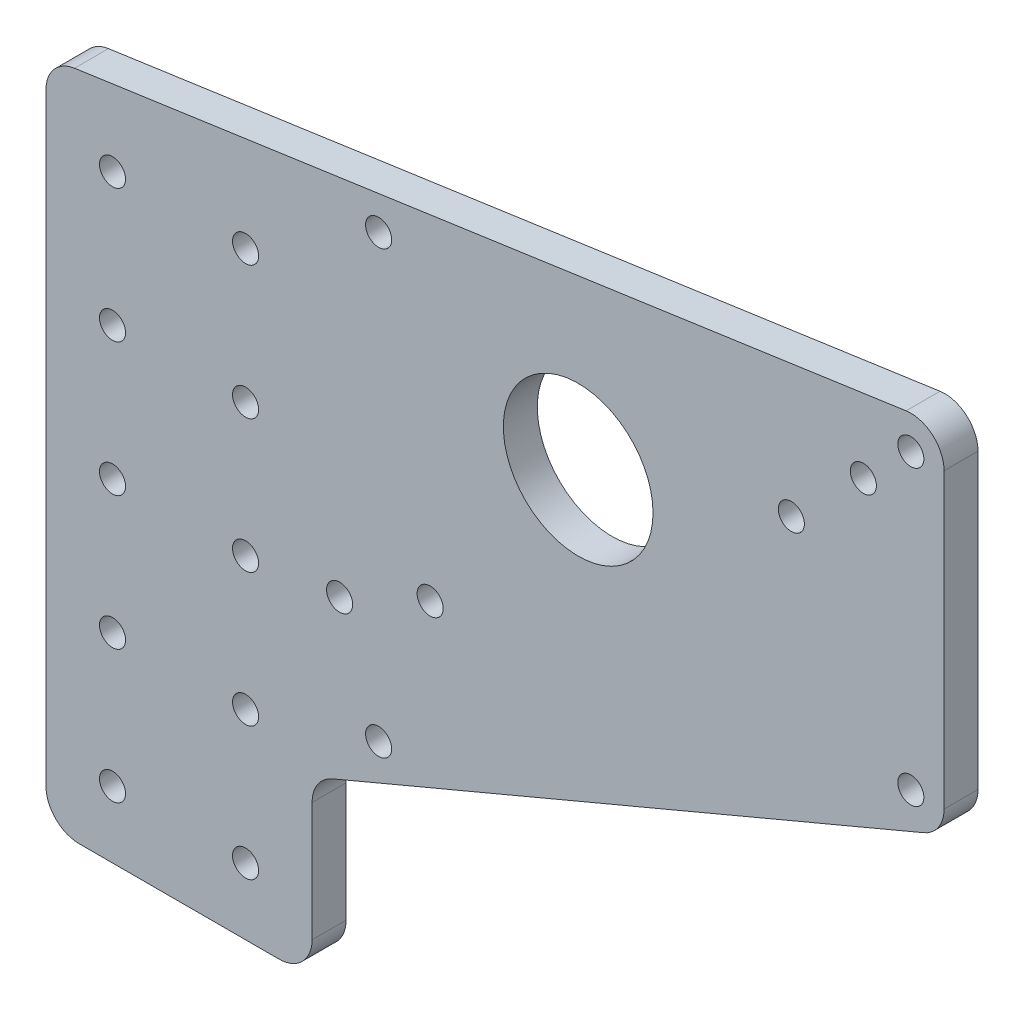
ISO-10303-21;
HEADER;
FILE_DESCRIPTION(('STEP AP214'),'2;1');
FILE_NAME('part.step','',(''),(''),'','','');
FILE_SCHEMA(('AUTOMOTIVE_DESIGN { 1 0 10303 214 1 1 1 1 }'));
ENDSEC;
DATA;
#1=APPLICATION_CONTEXT('core data for automotive mechanical design processes');
#2=APPLICATION_PROTOCOL_DEFINITION('international standard','automotive_design',2000,#1);
#3=PRODUCT_CONTEXT('',#1,'mechanical');
#4=PRODUCT('Part','Part','',(#3));
#5=PRODUCT_RELATED_PRODUCT_CATEGORY('part','',(#4));
#6=PRODUCT_DEFINITION_FORMATION('','',#4);
#7=PRODUCT_DEFINITION_CONTEXT('part definition',#1,'design');
#8=PRODUCT_DEFINITION('design','',#6,#7);
#9=PRODUCT_DEFINITION_SHAPE('','',#8);
#10=(LENGTH_UNIT() NAMED_UNIT(*) SI_UNIT(.MILLI.,.METRE.));
#11=(NAMED_UNIT(*) PLANE_ANGLE_UNIT() SI_UNIT($,.RADIAN.));
#12=(NAMED_UNIT(*) SI_UNIT($,.STERADIAN.) SOLID_ANGLE_UNIT());
#13=UNCERTAINTY_MEASURE_WITH_UNIT(LENGTH_MEASURE(1.E-05),#10,'distance_accuracy_value','');
#14=(GEOMETRIC_REPRESENTATION_CONTEXT(3) GLOBAL_UNCERTAINTY_ASSIGNED_CONTEXT((#13)) GLOBAL_UNIT_ASSIGNED_CONTEXT((#10,
#11,#12)) REPRESENTATION_CONTEXT('',''));
#15=CARTESIAN_POINT('',(0.,0.,0.));
#16=DIRECTION('',(0.,0.,1.));
#17=DIRECTION('',(1.,0.,0.));
#18=AXIS2_PLACEMENT_3D('',#15,#16,#17);
#19=CARTESIAN_POINT('',(482.6,0.,6.477));
#20=DIRECTION('',(1.,0.,0.));
#21=DIRECTION('',(0.,0.,-1.));
#22=AXIS2_PLACEMENT_3D('',#19,#20,#21);
#23=PLANE('',#22);
#24=DIRECTION('',(0.,-1.,0.));
#25=VECTOR('',#24,1.);
#26=CARTESIAN_POINT('',(482.6,0.,6.477));
#27=LINE('',#26,#25);
#28=CARTESIAN_POINT('',(482.6,621.620473744719,6.477));
#29=VERTEX_POINT('',#28);
#30=CARTESIAN_POINT('',(482.6,506.476,6.477));
#31=VERTEX_POINT('',#30);
#32=EDGE_CURVE('E148',#29,#31,#27,.T.);
#33=ORIENTED_EDGE('',*,*,#32,.F.);
#34=DIRECTION('',(0.,0.,-1.));
#35=VECTOR('',#34,1.);
#36=CARTESIAN_POINT('',(482.6,621.620473744719,0.));
#37=LINE('',#36,#35);
#38=CARTESIAN_POINT('',(482.6,621.620473744719,0.));
#39=VERTEX_POINT('',#38);
#40=EDGE_CURVE('E133',#29,#39,#37,.T.);
#41=ORIENTED_EDGE('',*,*,#40,.T.);
#42=DIRECTION('',(0.,-1.,0.));
#43=VECTOR('',#42,1.);
#44=CARTESIAN_POINT('',(482.6,0.,0.));
#45=LINE('',#44,#43);
#46=CARTESIAN_POINT('',(482.6,506.476,0.));
#47=VERTEX_POINT('',#46);
#48=EDGE_CURVE('E145',#39,#47,#45,.T.);
#49=ORIENTED_EDGE('',*,*,#48,.T.);
#50=DIRECTION('',(0.,0.,-1.));
#51=VECTOR('',#50,1.);
#52=CARTESIAN_POINT('',(482.6,506.476,6.477));
#53=LINE('',#52,#51);
#54=EDGE_CURVE('E150',#47,#31,#53,.F.);
#55=ORIENTED_EDGE('',*,*,#54,.T.);
#56=EDGE_LOOP('',(#33,#41,#49,#55));
#57=FACE_BOUND('',#56,.T.);
#58=ADVANCED_FACE('F39',(#57),#23,.F.);
#59=CARTESIAN_POINT('',(0.,500.126,6.477));
#60=DIRECTION('',(0.,1.,0.));
#61=DIRECTION('',(0.,0.,1.));
#62=AXIS2_PLACEMENT_3D('',#59,#60,#61);
#63=PLANE('',#62);
#64=DIRECTION('',(1.,0.,0.));
#65=VECTOR('',#64,1.);
#66=CARTESIAN_POINT('',(0.,500.126,6.477));
#67=LINE('',#66,#65);
#68=CARTESIAN_POINT('',(488.95,500.126,6.477));
#69=VERTEX_POINT('',#68);
#70=CARTESIAN_POINT('',(527.05,500.126,6.477));
#71=VERTEX_POINT('',#70);
#72=EDGE_CURVE('E237',#69,#71,#67,.T.);
#73=ORIENTED_EDGE('',*,*,#72,.F.);
#74=DIRECTION('',(0.,0.,-1.));
#75=VECTOR('',#74,1.);
#76=CARTESIAN_POINT('',(488.95,500.126,6.477));
#77=LINE('',#76,#75);
#78=CARTESIAN_POINT('',(488.95,500.126,0.));
#79=VERTEX_POINT('',#78);
#80=EDGE_CURVE('E212',#69,#79,#77,.T.);
#81=ORIENTED_EDGE('',*,*,#80,.T.);
#82=DIRECTION('',(1.,0.,0.));
#83=VECTOR('',#82,1.);
#84=CARTESIAN_POINT('',(0.,500.126,0.));
#85=LINE('',#84,#83);
#86=CARTESIAN_POINT('',(527.05,500.126,0.));
#87=VERTEX_POINT('',#86);
#88=EDGE_CURVE('E155',#79,#87,#85,.T.);
#89=ORIENTED_EDGE('',*,*,#88,.T.);
#90=DIRECTION('',(0.,0.,-1.));
#91=VECTOR('',#90,1.);
#92=CARTESIAN_POINT('',(527.05,500.126,6.477));
#93=LINE('',#92,#91);
#94=EDGE_CURVE('E210',#87,#71,#93,.F.);
#95=ORIENTED_EDGE('',*,*,#94,.T.);
#96=EDGE_LOOP('',(#73,#81,#89,#95));
#97=FACE_BOUND('',#96,.T.);
#98=ADVANCED_FACE('F261',(#97),#63,.F.);
#99=CARTESIAN_POINT('',(533.4,0.,6.477));
#100=DIRECTION('',(1.,0.,0.));
#101=DIRECTION('',(0.,0.,-1.));
#102=AXIS2_PLACEMENT_3D('',#99,#100,#101);
#103=PLANE('',#102);
#104=DIRECTION('',(0.,-1.,0.));
#105=VECTOR('',#104,1.);
#106=CARTESIAN_POINT('',(533.4,0.,0.));
#107=LINE('',#106,#105);
#108=CARTESIAN_POINT('',(533.4,529.183757704627,0.));
#109=VERTEX_POINT('',#108);
#110=CARTESIAN_POINT('',(533.4,506.476,0.));
#111=VERTEX_POINT('',#110);
#112=EDGE_CURVE('E159',#109,#111,#107,.T.);
#113=ORIENTED_EDGE('',*,*,#112,.F.);
#114=DIRECTION('',(0.,0.,-1.));
#115=VECTOR('',#114,1.);
#116=CARTESIAN_POINT('',(533.4,529.183757704627,6.477));
#117=LINE('',#116,#115);
#118=CARTESIAN_POINT('',(533.4,529.183757704627,6.477));
#119=VERTEX_POINT('',#118);
#120=EDGE_CURVE('E208',#109,#119,#117,.F.);
#121=ORIENTED_EDGE('',*,*,#120,.T.);
#122=DIRECTION('',(0.,-1.,0.));
#123=VECTOR('',#122,1.);
#124=CARTESIAN_POINT('',(533.4,0.,6.477));
#125=LINE('',#124,#123);
#126=CARTESIAN_POINT('',(533.4,506.476,6.477));
#127=VERTEX_POINT('',#126);
#128=EDGE_CURVE('E230',#119,#127,#125,.T.);
#129=ORIENTED_EDGE('',*,*,#128,.T.);
#130=DIRECTION('',(0.,0.,-1.));
#131=VECTOR('',#130,1.);
#132=CARTESIAN_POINT('',(533.4,506.476,0.));
#133=LINE('',#132,#131);
#134=EDGE_CURVE('E205',#127,#111,#133,.T.);
#135=ORIENTED_EDGE('',*,*,#134,.T.);
#136=EDGE_LOOP('',(#113,#121,#129,#135));
#137=FACE_BOUND('',#136,.T.);
#138=ADVANCED_FACE('F220',(#137),#103,.T.);
#139=CARTESIAN_POINT('',(-110.445176470612,262.307294117703,6.477));
#140=DIRECTION('',(0.388057000058133,-0.921635375138065,0.));
#141=DIRECTION('',(0.921635375138065,0.388057000058133,0.));
#142=AXIS2_PLACEMENT_3D('',#139,#140,#141);
#143=PLANE('',#142);
#144=DIRECTION('',(-0.921635375138065,-0.388057000058133,0.));
#145=VECTOR('',#144,1.);
#146=CARTESIAN_POINT('',(-110.445176470612,262.307294117703,0.));
#147=LINE('',#146,#145);
#148=CARTESIAN_POINT('',(650.164161950369,582.56385766338,0.));
#149=VERTEX_POINT('',#148);
#150=CARTESIAN_POINT('',(537.285838049631,535.036142336753,0.));
#151=VERTEX_POINT('',#150);
#152=EDGE_CURVE('E168',#149,#151,#147,.T.);
#153=ORIENTED_EDGE('',*,*,#152,.F.);
#154=DIRECTION('',(0.,0.,-1.));
#155=VECTOR('',#154,1.);
#156=CARTESIAN_POINT('',(650.164161950369,582.56385766338,6.477));
#157=LINE('',#156,#155);
#158=CARTESIAN_POINT('',(650.164161950369,582.56385766338,6.477));
#159=VERTEX_POINT('',#158);
#160=EDGE_CURVE('E203',#149,#159,#157,.F.);
#161=ORIENTED_EDGE('',*,*,#160,.T.);
#162=DIRECTION('',(-0.921635375138065,-0.388057000058133,0.));
#163=VECTOR('',#162,1.);
#164=CARTESIAN_POINT('',(-110.445176470612,262.307294117703,6.477));
#165=LINE('',#164,#163);
#166=CARTESIAN_POINT('',(537.285838049631,535.036142336753,6.477));
#167=VERTEX_POINT('',#166);
#168=EDGE_CURVE('E229',#159,#167,#165,.T.);
#169=ORIENTED_EDGE('',*,*,#168,.T.);
#170=DIRECTION('',(0.,0.,-1.));
#171=VECTOR('',#170,1.);
#172=CARTESIAN_POINT('',(537.285838049631,535.036142336753,0.));
#173=LINE('',#172,#171);
#174=EDGE_CURVE('E200',#167,#151,#173,.T.);
#175=ORIENTED_EDGE('',*,*,#174,.T.);
#176=EDGE_LOOP('',(#153,#161,#169,#175));
#177=FACE_BOUND('',#176,.T.);
#178=ADVANCED_FACE('F232',(#177),#143,.T.);
#179=CARTESIAN_POINT('',(654.05,0.,6.477));
#180=DIRECTION('',(1.,0.,0.));
#181=DIRECTION('',(0.,0.,-1.));
#182=AXIS2_PLACEMENT_3D('',#179,#180,#181);
#183=PLANE('',#182);
#184=DIRECTION('',(0.,-1.,0.));
#185=VECTOR('',#184,1.);
#186=CARTESIAN_POINT('',(654.05,0.,0.));
#187=LINE('',#186,#185);
#188=CARTESIAN_POINT('',(654.05,644.351453918517,0.));
#189=VERTEX_POINT('',#188);
#190=CARTESIAN_POINT('',(654.05,588.416242295507,0.));
#191=VERTEX_POINT('',#190);
#192=EDGE_CURVE('E171',#189,#191,#187,.T.);
#193=ORIENTED_EDGE('',*,*,#192,.F.);
#194=DIRECTION('',(0.,0.,-1.));
#195=VECTOR('',#194,1.);
#196=CARTESIAN_POINT('',(654.05,644.351453918517,6.477));
#197=LINE('',#196,#195);
#198=CARTESIAN_POINT('',(654.05,644.351453918517,6.477));
#199=VERTEX_POINT('',#198);
#200=EDGE_CURVE('E61',#189,#199,#197,.F.);
#201=ORIENTED_EDGE('',*,*,#200,.T.);
#202=DIRECTION('',(0.,-1.,0.));
#203=VECTOR('',#202,1.);
#204=CARTESIAN_POINT('',(654.05,0.,6.477));
#205=LINE('',#204,#203);
#206=CARTESIAN_POINT('',(654.05,588.416242295507,6.477));
#207=VERTEX_POINT('',#206);
#208=EDGE_CURVE('E234',#199,#207,#205,.T.);
#209=ORIENTED_EDGE('',*,*,#208,.T.);
#210=DIRECTION('',(0.,0.,-1.));
#211=VECTOR('',#210,1.);
#212=CARTESIAN_POINT('',(654.05,588.416242295507,6.477));
#213=LINE('',#212,#211);
#214=EDGE_CURVE('E196',#207,#191,#213,.T.);
#215=ORIENTED_EDGE('',*,*,#214,.T.);
#216=EDGE_LOOP('',(#193,#201,#209,#215));
#217=FACE_BOUND('',#216,.T.);
#218=ADVANCED_FACE('F247',(#217),#183,.T.);
#219=CARTESIAN_POINT('',(584.20000000001,609.600000000067,6.477));
#220=DIRECTION('',(0.,0.,-1.));
#221=DIRECTION('',(-1.,0.,0.));
#222=AXIS2_PLACEMENT_3D('',#219,#220,#221);
#223=CYLINDRICAL_SURFACE('',#222,14.2875000000112);
#224=CARTESIAN_POINT('',(584.20000000001,609.600000000067,6.477));
#225=DIRECTION('',(0.,0.,1.));
#226=DIRECTION('',(1.,0.,0.));
#227=AXIS2_PLACEMENT_3D('',#224,#225,#226);
#228=CIRCLE('',#227,14.2875000000112);
#229=CARTESIAN_POINT('',(598.487500000021,609.600000000067,6.477));
#230=VERTEX_POINT('',#229);
#231=EDGE_CURVE('E176',#230,#230,#228,.T.);
#232=ORIENTED_EDGE('',*,*,#231,.T.);
#233=EDGE_LOOP('',(#232));
#234=FACE_BOUND('',#233,.T.);
#235=CARTESIAN_POINT('',(584.20000000001,609.600000000067,0.));
#236=DIRECTION('',(0.,0.,1.));
#237=DIRECTION('',(1.,0.,0.));
#238=AXIS2_PLACEMENT_3D('',#235,#236,#237);
#239=CIRCLE('',#238,14.2875000000112);
#240=CARTESIAN_POINT('',(598.487500000021,609.600000000067,0.));
#241=VERTEX_POINT('',#240);
#242=EDGE_CURVE('E156',#241,#241,#239,.T.);
#243=ORIENTED_EDGE('',*,*,#242,.F.);
#244=EDGE_LOOP('',(#243));
#245=FACE_BOUND('',#244,.T.);
#246=ADVANCED_FACE('F270',(#234,#245),#223,.F.);
#247=CARTESIAN_POINT('',(-78.2966270222328,546.812739474692,6.477));
#248=DIRECTION('',(-0.141741613517293,0.989903689758511,0.));
#249=DIRECTION('',(-0.989903689758511,-0.141741613517293,0.));
#250=AXIS2_PLACEMENT_3D('',#247,#248,#249);
#251=PLANE('',#250);
#252=DIRECTION('',(0.989903689758511,0.141741613517293,0.));
#253=VECTOR('',#252,1.);
#254=CARTESIAN_POINT('',(-78.2966270222328,546.812739474692,0.));
#255=LINE('',#254,#253);
#256=CARTESIAN_POINT('',(488.049940754166,627.906362174685,0.));
#257=VERTEX_POINT('',#256);
#258=CARTESIAN_POINT('',(646.799940754166,650.637342348483,0.));
#259=VERTEX_POINT('',#258);
#260=EDGE_CURVE('E174',#257,#259,#255,.T.);
#261=ORIENTED_EDGE('',*,*,#260,.F.);
#262=DIRECTION('',(0.,0.,-1.));
#263=VECTOR('',#262,1.);
#264=CARTESIAN_POINT('',(488.049940754165,627.906362174685,6.477));
#265=LINE('',#264,#263);
#266=CARTESIAN_POINT('',(488.049940754166,627.906362174685,6.477));
#267=VERTEX_POINT('',#266);
#268=EDGE_CURVE('E134',#257,#267,#265,.F.);
#269=ORIENTED_EDGE('',*,*,#268,.T.);
#270=DIRECTION('',(0.989903689758511,0.141741613517293,0.));
#271=VECTOR('',#270,1.);
#272=CARTESIAN_POINT('',(-78.2966270222328,546.812739474692,6.477));
#273=LINE('',#272,#271);
#274=CARTESIAN_POINT('',(646.799940754166,650.637342348483,6.477));
#275=VERTEX_POINT('',#274);
#276=EDGE_CURVE('E177',#267,#275,#273,.T.);
#277=ORIENTED_EDGE('',*,*,#276,.T.);
#278=DIRECTION('',(0.,0.,-1.));
#279=VECTOR('',#278,1.);
#280=CARTESIAN_POINT('',(646.799940754165,650.637342348483,6.477));
#281=LINE('',#280,#279);
#282=EDGE_CURVE('E139',#275,#259,#281,.T.);
#283=ORIENTED_EDGE('',*,*,#282,.T.);
#284=EDGE_LOOP('',(#261,#269,#277,#283));
#285=FACE_BOUND('',#284,.T.);
#286=ADVANCED_FACE('F243',(#285),#251,.T.);
#287=CARTESIAN_POINT('',(0.,0.,6.477));
#288=DIRECTION('',(0.,0.,1.));
#289=DIRECTION('',(1.,0.,0.));
#290=AXIS2_PLACEMENT_3D('',#287,#288,#289);
#291=PLANE('',#290);
#292=CARTESIAN_POINT('',(538.656227349492,565.751163692027,6.477));
#293=DIRECTION('',(0.,0.,1.));
#294=DIRECTION('',(1.,0.,0.));
#295=AXIS2_PLACEMENT_3D('',#292,#293,#294);
#296=CIRCLE('',#295,2.48919999999994);
#297=CARTESIAN_POINT('',(541.145427349492,565.751163692027,6.477));
#298=VERTEX_POINT('',#297);
#299=EDGE_CURVE('E628',#298,#298,#296,.T.);
#300=ORIENTED_EDGE('',*,*,#299,.F.);
#301=EDGE_LOOP('',(#300));
#302=FACE_BOUND('',#301,.T.);
#303=CARTESIAN_POINT('',(624.886821056252,622.213290305826,6.477));
#304=DIRECTION('',(0.,0.,1.));
#305=DIRECTION('',(1.,0.,0.));
#306=AXIS2_PLACEMENT_3D('',#303,#304,#305);
#307=CIRCLE('',#306,2.48919999999927);
#308=CARTESIAN_POINT('',(627.376021056251,622.213290305826,6.477));
#309=VERTEX_POINT('',#308);
#310=EDGE_CURVE('E644',#309,#309,#307,.T.);
#311=ORIENTED_EDGE('',*,*,#310,.F.);
#312=EDGE_LOOP('',(#311));
#313=FACE_BOUND('',#312,.T.);
#314=CARTESIAN_POINT('',(638.638891417596,635.395970639378,6.477));
#315=DIRECTION('',(0.,0.,1.));
#316=DIRECTION('',(1.,0.,0.));
#317=AXIS2_PLACEMENT_3D('',#314,#315,#316);
#318=CIRCLE('',#317,2.48919999999983);
#319=CARTESIAN_POINT('',(641.128091417596,635.395970639378,6.477));
#320=VERTEX_POINT('',#319);
#321=EDGE_CURVE('E643',#320,#320,#318,.T.);
#322=ORIENTED_EDGE('',*,*,#321,.F.);
#323=EDGE_LOOP('',(#322));
#324=FACE_BOUND('',#323,.T.);
#325=CARTESIAN_POINT('',(555.940811586506,573.760261503491,6.477));
#326=DIRECTION('',(0.,0.,1.));
#327=DIRECTION('',(1.,0.,0.));
#328=AXIS2_PLACEMENT_3D('',#325,#326,#327);
#329=CIRCLE('',#328,2.4891999999998);
#330=CARTESIAN_POINT('',(558.430011586505,573.760261503491,6.477));
#331=VERTEX_POINT('',#330);
#332=EDGE_CURVE('E637',#331,#331,#329,.T.);
#333=ORIENTED_EDGE('',*,*,#332,.F.);
#334=EDGE_LOOP('',(#333));
#335=FACE_BOUND('',#334,.T.);
#336=CARTESIAN_POINT('',(520.700000000001,563.626,6.477));
#337=DIRECTION('',(0.,0.,1.));
#338=DIRECTION('',(1.,0.,0.));
#339=AXIS2_PLACEMENT_3D('',#336,#337,#338);
#340=CIRCLE('',#339,2.48919999999994);
#341=CARTESIAN_POINT('',(523.189200000001,563.626,6.477));
#342=VERTEX_POINT('',#341);
#343=EDGE_CURVE('E671',#342,#342,#340,.T.);
#344=ORIENTED_EDGE('',*,*,#343,.F.);
#345=EDGE_LOOP('',(#344));
#346=FACE_BOUND('',#345,.T.);
#347=CARTESIAN_POINT('',(495.300000000001,563.626,6.477));
#348=DIRECTION('',(0.,0.,1.));
#349=DIRECTION('',(1.,0.,0.));
#350=AXIS2_PLACEMENT_3D('',#347,#348,#349);
#351=CIRCLE('',#350,2.48919999999999);
#352=CARTESIAN_POINT('',(497.789200000001,563.626,6.477));
#353=VERTEX_POINT('',#352);
#354=EDGE_CURVE('E700',#353,#353,#351,.T.);
#355=ORIENTED_EDGE('',*,*,#354,.F.);
#356=EDGE_LOOP('',(#355));
#357=FACE_BOUND('',#356,.T.);
#358=CARTESIAN_POINT('',(520.7,589.026,6.477));
#359=DIRECTION('',(0.,0.,1.));
#360=DIRECTION('',(1.,0.,0.));
#361=AXIS2_PLACEMENT_3D('',#358,#359,#360);
#362=CIRCLE('',#361,2.48919999999994);
#363=CARTESIAN_POINT('',(523.1892,589.026,6.477));
#364=VERTEX_POINT('',#363);
#365=EDGE_CURVE('E694',#364,#364,#362,.T.);
#366=ORIENTED_EDGE('',*,*,#365,.F.);
#367=EDGE_LOOP('',(#366));
#368=FACE_BOUND('',#367,.T.);
#369=CARTESIAN_POINT('',(495.3,589.026,6.477));
#370=DIRECTION('',(0.,0.,1.));
#371=DIRECTION('',(1.,0.,0.));
#372=AXIS2_PLACEMENT_3D('',#369,#370,#371);
#373=CIRCLE('',#372,2.48919999999999);
#374=CARTESIAN_POINT('',(497.7892,589.026,6.477));
#375=VERTEX_POINT('',#374);
#376=EDGE_CURVE('E688',#375,#375,#373,.T.);
#377=ORIENTED_EDGE('',*,*,#376,.F.);
#378=EDGE_LOOP('',(#377));
#379=FACE_BOUND('',#378,.T.);
#380=CARTESIAN_POINT('',(495.3,614.426,6.477));
#381=DIRECTION('',(0.,0.,1.));
#382=DIRECTION('',(1.,0.,0.));
#383=AXIS2_PLACEMENT_3D('',#380,#381,#382);
#384=CIRCLE('',#383,2.48919999999999);
#385=CARTESIAN_POINT('',(497.7892,614.426,6.477));
#386=VERTEX_POINT('',#385);
#387=EDGE_CURVE('E687',#386,#386,#384,.T.);
#388=ORIENTED_EDGE('',*,*,#387,.F.);
#389=EDGE_LOOP('',(#388));
#390=FACE_BOUND('',#389,.T.);
#391=CARTESIAN_POINT('',(520.7,614.426,6.477));
#392=DIRECTION('',(0.,0.,1.));
#393=DIRECTION('',(1.,0.,0.));
#394=AXIS2_PLACEMENT_3D('',#391,#392,#393);
#395=CIRCLE('',#394,2.48920000000004);
#396=CARTESIAN_POINT('',(523.1892,614.426,6.477));
#397=VERTEX_POINT('',#396);
#398=EDGE_CURVE('E723',#397,#397,#395,.T.);
#399=ORIENTED_EDGE('',*,*,#398,.F.);
#400=EDGE_LOOP('',(#399));
#401=FACE_BOUND('',#400,.T.);
#402=CARTESIAN_POINT('',(520.700000000001,538.226,6.477));
#403=DIRECTION('',(0.,0.,1.));
#404=DIRECTION('',(1.,0.,0.));
#405=AXIS2_PLACEMENT_3D('',#402,#403,#404);
#406=CIRCLE('',#405,2.48920000000008);
#407=CARTESIAN_POINT('',(523.189200000001,538.226,6.477));
#408=VERTEX_POINT('',#407);
#409=EDGE_CURVE('E717',#408,#408,#406,.T.);
#410=ORIENTED_EDGE('',*,*,#409,.F.);
#411=EDGE_LOOP('',(#410));
#412=FACE_BOUND('',#411,.T.);
#413=CARTESIAN_POINT('',(495.300000000001,538.226,6.477));
#414=DIRECTION('',(0.,0.,1.));
#415=DIRECTION('',(1.,0.,0.));
#416=AXIS2_PLACEMENT_3D('',#413,#414,#415);
#417=CIRCLE('',#416,2.48920000000002);
#418=CARTESIAN_POINT('',(497.789200000001,538.226,6.477));
#419=VERTEX_POINT('',#418);
#420=EDGE_CURVE('E711',#419,#419,#417,.T.);
#421=ORIENTED_EDGE('',*,*,#420,.F.);
#422=EDGE_LOOP('',(#421));
#423=FACE_BOUND('',#422,.T.);
#424=CARTESIAN_POINT('',(647.7,588.416242295507,6.477));
#425=DIRECTION('',(0.,0.,1.));
#426=DIRECTION('',(1.,0.,0.));
#427=AXIS2_PLACEMENT_3D('',#424,#425,#426);
#428=CIRCLE('',#427,2.48919999999994);
#429=CARTESIAN_POINT('',(650.1892,588.416242295507,6.477));
#430=VERTEX_POINT('',#429);
#431=EDGE_CURVE('E664',#430,#430,#428,.T.);
#432=ORIENTED_EDGE('',*,*,#431,.F.);
#433=EDGE_LOOP('',(#432));
#434=FACE_BOUND('',#433,.T.);
#435=CARTESIAN_POINT('',(546.1,545.637294927086,6.477));
#436=DIRECTION('',(0.,0.,1.));
#437=DIRECTION('',(1.,0.,0.));
#438=AXIS2_PLACEMENT_3D('',#435,#436,#437);
#439=CIRCLE('',#438,2.48919999999994);
#440=CARTESIAN_POINT('',(548.5892,545.637294927086,6.477));
#441=VERTEX_POINT('',#440);
#442=EDGE_CURVE('E658',#441,#441,#439,.T.);
#443=ORIENTED_EDGE('',*,*,#442,.F.);
#444=EDGE_LOOP('',(#443));
#445=FACE_BOUND('',#444,.T.);
#446=CARTESIAN_POINT('',(546.1,629.803626607286,6.477));
#447=DIRECTION('',(0.,0.,1.));
#448=DIRECTION('',(1.,0.,0.));
#449=AXIS2_PLACEMENT_3D('',#446,#447,#448);
#450=CIRCLE('',#449,2.48919999999994);
#451=CARTESIAN_POINT('',(548.5892,629.803626607286,6.477));
#452=VERTEX_POINT('',#451);
#453=EDGE_CURVE('E657',#452,#452,#450,.T.);
#454=ORIENTED_EDGE('',*,*,#453,.F.);
#455=EDGE_LOOP('',(#454));
#456=FACE_BOUND('',#455,.T.);
#457=CARTESIAN_POINT('',(520.7,512.826,6.477));
#458=DIRECTION('',(0.,0.,1.));
#459=DIRECTION('',(1.,0.,0.));
#460=AXIS2_PLACEMENT_3D('',#457,#458,#459);
#461=CIRCLE('',#460,2.48920000000004);
#462=CARTESIAN_POINT('',(523.1892,512.826,6.477));
#463=VERTEX_POINT('',#462);
#464=EDGE_CURVE('E672',#463,#463,#461,.T.);
#465=ORIENTED_EDGE('',*,*,#464,.F.);
#466=EDGE_LOOP('',(#465));
#467=FACE_BOUND('',#466,.T.);
#468=CARTESIAN_POINT('',(647.7,644.351453918517,6.477));
#469=DIRECTION('',(0.,0.,1.));
#470=DIRECTION('',(1.,0.,0.));
#471=AXIS2_PLACEMENT_3D('',#468,#469,#470);
#472=CIRCLE('',#471,2.48919999999994);
#473=CARTESIAN_POINT('',(650.1892,644.351453918517,6.477));
#474=VERTEX_POINT('',#473);
#475=EDGE_CURVE('E634',#474,#474,#472,.T.);
#476=ORIENTED_EDGE('',*,*,#475,.F.);
#477=EDGE_LOOP('',(#476));
#478=FACE_BOUND('',#477,.T.);
#479=CARTESIAN_POINT('',(495.3,512.826,6.477));
#480=DIRECTION('',(0.,0.,1.));
#481=DIRECTION('',(1.,0.,0.));
#482=AXIS2_PLACEMENT_3D('',#479,#480,#481);
#483=CIRCLE('',#482,2.48919999999999);
#484=CARTESIAN_POINT('',(497.7892,512.826,6.477));
#485=VERTEX_POINT('',#484);
#486=EDGE_CURVE('E162',#485,#485,#483,.T.);
#487=ORIENTED_EDGE('',*,*,#486,.F.);
#488=EDGE_LOOP('',(#487));
#489=FACE_BOUND('',#488,.T.);
#490=ORIENTED_EDGE('',*,*,#231,.F.);
#491=EDGE_LOOP('',(#490));
#492=FACE_BOUND('',#491,.T.);
#493=ORIENTED_EDGE('',*,*,#276,.F.);
#494=CARTESIAN_POINT('',(488.95,621.620473744719,6.477));
#495=DIRECTION('',(0.,0.,1.));
#496=DIRECTION('',(1.,0.,0.));
#497=AXIS2_PLACEMENT_3D('',#494,#495,#496);
#498=CIRCLE('',#497,6.35);
#499=EDGE_CURVE('E194',#267,#29,#498,.T.);
#500=ORIENTED_EDGE('',*,*,#499,.T.);
#501=ORIENTED_EDGE('',*,*,#32,.T.);
#502=CARTESIAN_POINT('',(488.95,506.476,6.477));
#503=DIRECTION('',(0.,0.,1.));
#504=DIRECTION('',(1.,0.,0.));
#505=AXIS2_PLACEMENT_3D('',#502,#503,#504);
#506=CIRCLE('',#505,6.35);
#507=EDGE_CURVE('E189',#31,#69,#506,.T.);
#508=ORIENTED_EDGE('',*,*,#507,.T.);
#509=ORIENTED_EDGE('',*,*,#72,.T.);
#510=CARTESIAN_POINT('',(527.05,506.476,6.477));
#511=DIRECTION('',(0.,0.,1.));
#512=DIRECTION('',(1.,0.,0.));
#513=AXIS2_PLACEMENT_3D('',#510,#511,#512);
#514=CIRCLE('',#513,6.35);
#515=EDGE_CURVE('E187',#71,#127,#514,.T.);
#516=ORIENTED_EDGE('',*,*,#515,.T.);
#517=ORIENTED_EDGE('',*,*,#128,.F.);
#518=CARTESIAN_POINT('',(539.75,529.183757704627,6.477));
#519=DIRECTION('',(0.,0.,1.));
#520=DIRECTION('',(1.,0.,0.));
#521=AXIS2_PLACEMENT_3D('',#518,#519,#520);
#522=CIRCLE('',#521,6.35);
#523=EDGE_CURVE('E11',#119,#167,#522,.F.);
#524=ORIENTED_EDGE('',*,*,#523,.T.);
#525=ORIENTED_EDGE('',*,*,#168,.F.);
#526=CARTESIAN_POINT('',(647.7,588.416242295507,6.477));
#527=DIRECTION('',(0.,0.,1.));
#528=DIRECTION('',(1.,0.,0.));
#529=AXIS2_PLACEMENT_3D('',#526,#527,#528);
#530=CIRCLE('',#529,6.35);
#531=EDGE_CURVE('E54',#159,#207,#530,.T.);
#532=ORIENTED_EDGE('',*,*,#531,.T.);
#533=ORIENTED_EDGE('',*,*,#208,.F.);
#534=CARTESIAN_POINT('',(647.7,644.351453918517,6.477));
#535=DIRECTION('',(0.,0.,1.));
#536=DIRECTION('',(1.,0.,0.));
#537=AXIS2_PLACEMENT_3D('',#534,#535,#536);
#538=CIRCLE('',#537,6.35);
#539=EDGE_CURVE('E192',#199,#275,#538,.T.);
#540=ORIENTED_EDGE('',*,*,#539,.T.);
#541=EDGE_LOOP('',(#493,#500,#501,#508,#509,#516,#517,#524,#525,#532,#533,#540));
#542=FACE_BOUND('',#541,.T.);
#543=ADVANCED_FACE('F228',(#302,#313,#324,#335,#346,#357,#368,#379,#390,#401,#412,#423,#434,
#445,#456,#467,#478,#489,#492,#542),#291,.T.);
#544=CARTESIAN_POINT('',(0.,0.,0.));
#545=DIRECTION('',(0.,0.,1.));
#546=DIRECTION('',(1.,0.,0.));
#547=AXIS2_PLACEMENT_3D('',#544,#545,#546);
#548=PLANE('',#547);
#549=CARTESIAN_POINT('',(538.656227349492,565.751163692027,0.));
#550=DIRECTION('',(0.,0.,1.));
#551=DIRECTION('',(1.,0.,0.));
#552=AXIS2_PLACEMENT_3D('',#549,#550,#551);
#553=CIRCLE('',#552,2.48919999999994);
#554=CARTESIAN_POINT('',(541.145427349492,565.751163692027,0.));
#555=VERTEX_POINT('',#554);
#556=EDGE_CURVE('E631',#555,#555,#553,.T.);
#557=ORIENTED_EDGE('',*,*,#556,.T.);
#558=EDGE_LOOP('',(#557));
#559=FACE_BOUND('',#558,.T.);
#560=CARTESIAN_POINT('',(624.886821056252,622.213290305826,0.));
#561=DIRECTION('',(0.,0.,1.));
#562=DIRECTION('',(1.,0.,0.));
#563=AXIS2_PLACEMENT_3D('',#560,#561,#562);
#564=CIRCLE('',#563,2.48919999999927);
#565=CARTESIAN_POINT('',(627.376021056251,622.213290305826,0.));
#566=VERTEX_POINT('',#565);
#567=EDGE_CURVE('E640',#566,#566,#564,.T.);
#568=ORIENTED_EDGE('',*,*,#567,.T.);
#569=EDGE_LOOP('',(#568));
#570=FACE_BOUND('',#569,.T.);
#571=CARTESIAN_POINT('',(638.638891417596,635.395970639378,0.));
#572=DIRECTION('',(0.,0.,1.));
#573=DIRECTION('',(1.,0.,0.));
#574=AXIS2_PLACEMENT_3D('',#571,#572,#573);
#575=CIRCLE('',#574,2.48919999999983);
#576=CARTESIAN_POINT('',(641.128091417596,635.395970639378,0.));
#577=VERTEX_POINT('',#576);
#578=EDGE_CURVE('E649',#577,#577,#575,.T.);
#579=ORIENTED_EDGE('',*,*,#578,.T.);
#580=EDGE_LOOP('',(#579));
#581=FACE_BOUND('',#580,.T.);
#582=CARTESIAN_POINT('',(555.940811586506,573.760261503491,0.));
#583=DIRECTION('',(0.,0.,1.));
#584=DIRECTION('',(1.,0.,0.));
#585=AXIS2_PLACEMENT_3D('',#582,#583,#584);
#586=CIRCLE('',#585,2.4891999999998);
#587=CARTESIAN_POINT('',(558.430011586505,573.760261503491,0.));
#588=VERTEX_POINT('',#587);
#589=EDGE_CURVE('E632',#588,#588,#586,.T.);
#590=ORIENTED_EDGE('',*,*,#589,.T.);
#591=EDGE_LOOP('',(#590));
#592=FACE_BOUND('',#591,.T.);
#593=CARTESIAN_POINT('',(520.700000000001,563.626,0.));
#594=DIRECTION('',(0.,0.,1.));
#595=DIRECTION('',(1.,0.,0.));
#596=AXIS2_PLACEMENT_3D('',#593,#594,#595);
#597=CIRCLE('',#596,2.48919999999994);
#598=CARTESIAN_POINT('',(523.189200000001,563.626,0.));
#599=VERTEX_POINT('',#598);
#600=EDGE_CURVE('E703',#599,#599,#597,.T.);
#601=ORIENTED_EDGE('',*,*,#600,.T.);
#602=EDGE_LOOP('',(#601));
#603=FACE_BOUND('',#602,.T.);
#604=CARTESIAN_POINT('',(495.300000000001,563.626,0.));
#605=DIRECTION('',(0.,0.,1.));
#606=DIRECTION('',(1.,0.,0.));
#607=AXIS2_PLACEMENT_3D('',#604,#605,#606);
#608=CIRCLE('',#607,2.48919999999999);
#609=CARTESIAN_POINT('',(497.789200000001,563.626,0.));
#610=VERTEX_POINT('',#609);
#611=EDGE_CURVE('E697',#610,#610,#608,.T.);
#612=ORIENTED_EDGE('',*,*,#611,.T.);
#613=EDGE_LOOP('',(#612));
#614=FACE_BOUND('',#613,.T.);
#615=CARTESIAN_POINT('',(520.7,589.026,0.));
#616=DIRECTION('',(0.,0.,1.));
#617=DIRECTION('',(1.,0.,0.));
#618=AXIS2_PLACEMENT_3D('',#615,#616,#617);
#619=CIRCLE('',#618,2.48919999999994);
#620=CARTESIAN_POINT('',(523.1892,589.026,0.));
#621=VERTEX_POINT('',#620);
#622=EDGE_CURVE('E691',#621,#621,#619,.T.);
#623=ORIENTED_EDGE('',*,*,#622,.T.);
#624=EDGE_LOOP('',(#623));
#625=FACE_BOUND('',#624,.T.);
#626=CARTESIAN_POINT('',(495.3,589.026,0.));
#627=DIRECTION('',(0.,0.,1.));
#628=DIRECTION('',(1.,0.,0.));
#629=AXIS2_PLACEMENT_3D('',#626,#627,#628);
#630=CIRCLE('',#629,2.48919999999999);
#631=CARTESIAN_POINT('',(497.7892,589.026,0.));
#632=VERTEX_POINT('',#631);
#633=EDGE_CURVE('E684',#632,#632,#630,.T.);
#634=ORIENTED_EDGE('',*,*,#633,.T.);
#635=EDGE_LOOP('',(#634));
#636=FACE_BOUND('',#635,.T.);
#637=CARTESIAN_POINT('',(495.3,614.426,0.));
#638=DIRECTION('',(0.,0.,1.));
#639=DIRECTION('',(1.,0.,0.));
#640=AXIS2_PLACEMENT_3D('',#637,#638,#639);
#641=CIRCLE('',#640,2.48919999999999);
#642=CARTESIAN_POINT('',(497.7892,614.426,0.));
#643=VERTEX_POINT('',#642);
#644=EDGE_CURVE('E726',#643,#643,#641,.T.);
#645=ORIENTED_EDGE('',*,*,#644,.T.);
#646=EDGE_LOOP('',(#645));
#647=FACE_BOUND('',#646,.T.);
#648=CARTESIAN_POINT('',(520.7,614.426,0.));
#649=DIRECTION('',(0.,0.,1.));
#650=DIRECTION('',(1.,0.,0.));
#651=AXIS2_PLACEMENT_3D('',#648,#649,#650);
#652=CIRCLE('',#651,2.48920000000004);
#653=CARTESIAN_POINT('',(523.1892,614.426,0.));
#654=VERTEX_POINT('',#653);
#655=EDGE_CURVE('E720',#654,#654,#652,.T.);
#656=ORIENTED_EDGE('',*,*,#655,.T.);
#657=EDGE_LOOP('',(#656));
#658=FACE_BOUND('',#657,.T.);
#659=CARTESIAN_POINT('',(520.700000000001,538.226,0.));
#660=DIRECTION('',(0.,0.,1.));
#661=DIRECTION('',(1.,0.,0.));
#662=AXIS2_PLACEMENT_3D('',#659,#660,#661);
#663=CIRCLE('',#662,2.48920000000008);
#664=CARTESIAN_POINT('',(523.189200000001,538.226,0.));
#665=VERTEX_POINT('',#664);
#666=EDGE_CURVE('E714',#665,#665,#663,.T.);
#667=ORIENTED_EDGE('',*,*,#666,.T.);
#668=EDGE_LOOP('',(#667));
#669=FACE_BOUND('',#668,.T.);
#670=CARTESIAN_POINT('',(495.300000000001,538.226,0.));
#671=DIRECTION('',(0.,0.,1.));
#672=DIRECTION('',(1.,0.,0.));
#673=AXIS2_PLACEMENT_3D('',#670,#671,#672);
#674=CIRCLE('',#673,2.48920000000002);
#675=CARTESIAN_POINT('',(497.789200000001,538.226,0.));
#676=VERTEX_POINT('',#675);
#677=EDGE_CURVE('E707',#676,#676,#674,.T.);
#678=ORIENTED_EDGE('',*,*,#677,.T.);
#679=EDGE_LOOP('',(#678));
#680=FACE_BOUND('',#679,.T.);
#681=CARTESIAN_POINT('',(647.7,588.416242295507,0.));
#682=DIRECTION('',(0.,0.,1.));
#683=DIRECTION('',(1.,0.,0.));
#684=AXIS2_PLACEMENT_3D('',#681,#682,#683);
#685=CIRCLE('',#684,2.48919999999994);
#686=CARTESIAN_POINT('',(650.1892,588.416242295507,0.));
#687=VERTEX_POINT('',#686);
#688=EDGE_CURVE('E661',#687,#687,#685,.T.);
#689=ORIENTED_EDGE('',*,*,#688,.T.);
#690=EDGE_LOOP('',(#689));
#691=FACE_BOUND('',#690,.T.);
#692=CARTESIAN_POINT('',(546.1,545.637294927086,0.));
#693=DIRECTION('',(0.,0.,1.));
#694=DIRECTION('',(1.,0.,0.));
#695=AXIS2_PLACEMENT_3D('',#692,#693,#694);
#696=CIRCLE('',#695,2.48919999999994);
#697=CARTESIAN_POINT('',(548.5892,545.637294927086,0.));
#698=VERTEX_POINT('',#697);
#699=EDGE_CURVE('E654',#698,#698,#696,.T.);
#700=ORIENTED_EDGE('',*,*,#699,.T.);
#701=EDGE_LOOP('',(#700));
#702=FACE_BOUND('',#701,.T.);
#703=CARTESIAN_POINT('',(546.1,629.803626607286,0.));
#704=DIRECTION('',(0.,0.,1.));
#705=DIRECTION('',(1.,0.,0.));
#706=AXIS2_PLACEMENT_3D('',#703,#704,#705);
#707=CIRCLE('',#706,2.48919999999994);
#708=CARTESIAN_POINT('',(548.5892,629.803626607286,0.));
#709=VERTEX_POINT('',#708);
#710=EDGE_CURVE('E675',#709,#709,#707,.T.);
#711=ORIENTED_EDGE('',*,*,#710,.T.);
#712=EDGE_LOOP('',(#711));
#713=FACE_BOUND('',#712,.T.);
#714=CARTESIAN_POINT('',(520.7,512.826,0.));
#715=DIRECTION('',(0.,0.,1.));
#716=DIRECTION('',(1.,0.,0.));
#717=AXIS2_PLACEMENT_3D('',#714,#715,#716);
#718=CIRCLE('',#717,2.48920000000004);
#719=CARTESIAN_POINT('',(523.1892,512.826,0.));
#720=VERTEX_POINT('',#719);
#721=EDGE_CURVE('E668',#720,#720,#718,.T.);
#722=ORIENTED_EDGE('',*,*,#721,.T.);
#723=EDGE_LOOP('',(#722));
#724=FACE_BOUND('',#723,.T.);
#725=CARTESIAN_POINT('',(647.7,644.351453918517,0.));
#726=DIRECTION('',(0.,0.,1.));
#727=DIRECTION('',(1.,0.,0.));
#728=AXIS2_PLACEMENT_3D('',#725,#726,#727);
#729=CIRCLE('',#728,2.48919999999994);
#730=CARTESIAN_POINT('',(650.1892,644.351453918517,0.));
#731=VERTEX_POINT('',#730);
#732=EDGE_CURVE('E667',#731,#731,#729,.T.);
#733=ORIENTED_EDGE('',*,*,#732,.T.);
#734=EDGE_LOOP('',(#733));
#735=FACE_BOUND('',#734,.T.);
#736=CARTESIAN_POINT('',(495.3,512.826,0.));
#737=DIRECTION('',(0.,0.,1.));
#738=DIRECTION('',(1.,0.,0.));
#739=AXIS2_PLACEMENT_3D('',#736,#737,#738);
#740=CIRCLE('',#739,2.48919999999999);
#741=CARTESIAN_POINT('',(497.7892,512.826,0.));
#742=VERTEX_POINT('',#741);
#743=EDGE_CURVE('E710',#742,#742,#740,.T.);
#744=ORIENTED_EDGE('',*,*,#743,.T.);
#745=EDGE_LOOP('',(#744));
#746=FACE_BOUND('',#745,.T.);
#747=ORIENTED_EDGE('',*,*,#242,.T.);
#748=EDGE_LOOP('',(#747));
#749=FACE_BOUND('',#748,.T.);
#750=ORIENTED_EDGE('',*,*,#48,.F.);
#751=CARTESIAN_POINT('',(488.95,621.620473744719,0.));
#752=DIRECTION('',(0.,0.,1.));
#753=DIRECTION('',(1.,0.,0.));
#754=AXIS2_PLACEMENT_3D('',#751,#752,#753);
#755=CIRCLE('',#754,6.35);
#756=EDGE_CURVE('E129',#39,#257,#755,.F.);
#757=ORIENTED_EDGE('',*,*,#756,.T.);
#758=ORIENTED_EDGE('',*,*,#260,.T.);
#759=CARTESIAN_POINT('',(647.7,644.351453918517,0.));
#760=DIRECTION('',(0.,0.,1.));
#761=DIRECTION('',(1.,0.,0.));
#762=AXIS2_PLACEMENT_3D('',#759,#760,#761);
#763=CIRCLE('',#762,6.35);
#764=EDGE_CURVE('E140',#259,#189,#763,.F.);
#765=ORIENTED_EDGE('',*,*,#764,.T.);
#766=ORIENTED_EDGE('',*,*,#192,.T.);
#767=CARTESIAN_POINT('',(647.7,588.416242295507,0.));
#768=DIRECTION('',(0.,0.,1.));
#769=DIRECTION('',(1.,0.,0.));
#770=AXIS2_PLACEMENT_3D('',#767,#768,#769);
#771=CIRCLE('',#770,6.35);
#772=EDGE_CURVE('E181',#191,#149,#771,.F.);
#773=ORIENTED_EDGE('',*,*,#772,.T.);
#774=ORIENTED_EDGE('',*,*,#152,.T.);
#775=CARTESIAN_POINT('',(539.75,529.183757704627,0.));
#776=DIRECTION('',(0.,0.,1.));
#777=DIRECTION('',(1.,0.,0.));
#778=AXIS2_PLACEMENT_3D('',#775,#776,#777);
#779=CIRCLE('',#778,6.35);
#780=EDGE_CURVE('E47',#151,#109,#779,.T.);
#781=ORIENTED_EDGE('',*,*,#780,.T.);
#782=ORIENTED_EDGE('',*,*,#112,.T.);
#783=CARTESIAN_POINT('',(527.05,506.476,0.));
#784=DIRECTION('',(0.,0.,1.));
#785=DIRECTION('',(1.,0.,0.));
#786=AXIS2_PLACEMENT_3D('',#783,#784,#785);
#787=CIRCLE('',#786,6.35);
#788=EDGE_CURVE('E149',#111,#87,#787,.F.);
#789=ORIENTED_EDGE('',*,*,#788,.T.);
#790=ORIENTED_EDGE('',*,*,#88,.F.);
#791=CARTESIAN_POINT('',(488.95,506.476,0.));
#792=DIRECTION('',(0.,0.,1.));
#793=DIRECTION('',(1.,0.,0.));
#794=AXIS2_PLACEMENT_3D('',#791,#792,#793);
#795=CIRCLE('',#794,6.35);
#796=EDGE_CURVE('E154',#79,#47,#795,.F.);
#797=ORIENTED_EDGE('',*,*,#796,.T.);
#798=EDGE_LOOP('',(#750,#757,#758,#765,#766,#773,#774,#781,#782,#789,#790,#797));
#799=FACE_BOUND('',#798,.T.);
#800=ADVANCED_FACE('F152',(#559,#570,#581,#592,#603,#614,#625,#636,#647,#658,#669,#680,#691,
#702,#713,#724,#735,#746,#749,#799),#548,.F.);
#801=CARTESIAN_POINT('',(495.3,512.826,6.477));
#802=DIRECTION('',(0.,0.,-1.));
#803=DIRECTION('',(-1.,0.,0.));
#804=AXIS2_PLACEMENT_3D('',#801,#802,#803);
#805=CYLINDRICAL_SURFACE('',#804,2.48919999999999);
#806=ORIENTED_EDGE('',*,*,#486,.T.);
#807=EDGE_LOOP('',(#806));
#808=FACE_BOUND('',#807,.T.);
#809=ORIENTED_EDGE('',*,*,#743,.F.);
#810=EDGE_LOOP('',(#809));
#811=FACE_BOUND('',#810,.T.);
#812=ADVANCED_FACE('F310',(#808,#811),#805,.F.);
#813=CARTESIAN_POINT('',(647.7,644.351453918517,6.477));
#814=DIRECTION('',(0.,0.,-1.));
#815=DIRECTION('',(-1.,0.,0.));
#816=AXIS2_PLACEMENT_3D('',#813,#814,#815);
#817=CYLINDRICAL_SURFACE('',#816,2.48919999999994);
#818=ORIENTED_EDGE('',*,*,#475,.T.);
#819=EDGE_LOOP('',(#818));
#820=FACE_BOUND('',#819,.T.);
#821=ORIENTED_EDGE('',*,*,#732,.F.);
#822=EDGE_LOOP('',(#821));
#823=FACE_BOUND('',#822,.T.);
#824=ADVANCED_FACE('F313',(#820,#823),#817,.F.);
#825=CARTESIAN_POINT('',(520.7,512.826,6.477));
#826=DIRECTION('',(0.,0.,-1.));
#827=DIRECTION('',(-1.,0.,0.));
#828=AXIS2_PLACEMENT_3D('',#825,#826,#827);
#829=CYLINDRICAL_SURFACE('',#828,2.48920000000004);
#830=ORIENTED_EDGE('',*,*,#464,.T.);
#831=EDGE_LOOP('',(#830));
#832=FACE_BOUND('',#831,.T.);
#833=ORIENTED_EDGE('',*,*,#721,.F.);
#834=EDGE_LOOP('',(#833));
#835=FACE_BOUND('',#834,.T.);
#836=ADVANCED_FACE('F367',(#832,#835),#829,.F.);
#837=CARTESIAN_POINT('',(546.1,629.803626607286,6.477));
#838=DIRECTION('',(0.,0.,-1.));
#839=DIRECTION('',(-1.,0.,0.));
#840=AXIS2_PLACEMENT_3D('',#837,#838,#839);
#841=CYLINDRICAL_SURFACE('',#840,2.48919999999994);
#842=ORIENTED_EDGE('',*,*,#453,.T.);
#843=EDGE_LOOP('',(#842));
#844=FACE_BOUND('',#843,.T.);
#845=ORIENTED_EDGE('',*,*,#710,.F.);
#846=EDGE_LOOP('',(#845));
#847=FACE_BOUND('',#846,.T.);
#848=ADVANCED_FACE('F375',(#844,#847),#841,.F.);
#849=CARTESIAN_POINT('',(546.1,545.637294927086,6.477));
#850=DIRECTION('',(0.,0.,-1.));
#851=DIRECTION('',(-1.,0.,0.));
#852=AXIS2_PLACEMENT_3D('',#849,#850,#851);
#853=CYLINDRICAL_SURFACE('',#852,2.48919999999994);
#854=ORIENTED_EDGE('',*,*,#442,.T.);
#855=EDGE_LOOP('',(#854));
#856=FACE_BOUND('',#855,.T.);
#857=ORIENTED_EDGE('',*,*,#699,.F.);
#858=EDGE_LOOP('',(#857));
#859=FACE_BOUND('',#858,.T.);
#860=ADVANCED_FACE('F383',(#856,#859),#853,.F.);
#861=CARTESIAN_POINT('',(647.7,588.416242295507,6.477));
#862=DIRECTION('',(0.,0.,-1.));
#863=DIRECTION('',(-1.,0.,0.));
#864=AXIS2_PLACEMENT_3D('',#861,#862,#863);
#865=CYLINDRICAL_SURFACE('',#864,2.48919999999994);
#866=ORIENTED_EDGE('',*,*,#431,.T.);
#867=EDGE_LOOP('',(#866));
#868=FACE_BOUND('',#867,.T.);
#869=ORIENTED_EDGE('',*,*,#688,.F.);
#870=EDGE_LOOP('',(#869));
#871=FACE_BOUND('',#870,.T.);
#872=ADVANCED_FACE('F296',(#868,#871),#865,.F.);
#873=CARTESIAN_POINT('',(495.300000000001,538.226,6.477));
#874=DIRECTION('',(0.,0.,-1.));
#875=DIRECTION('',(-1.,0.,0.));
#876=AXIS2_PLACEMENT_3D('',#873,#874,#875);
#877=CYLINDRICAL_SURFACE('',#876,2.48920000000002);
#878=ORIENTED_EDGE('',*,*,#420,.T.);
#879=EDGE_LOOP('',(#878));
#880=FACE_BOUND('',#879,.T.);
#881=ORIENTED_EDGE('',*,*,#677,.F.);
#882=EDGE_LOOP('',(#881));
#883=FACE_BOUND('',#882,.T.);
#884=ADVANCED_FACE('F292',(#880,#883),#877,.F.);
#885=CARTESIAN_POINT('',(520.700000000001,538.226,6.477));
#886=DIRECTION('',(0.,0.,-1.));
#887=DIRECTION('',(-1.,0.,0.));
#888=AXIS2_PLACEMENT_3D('',#885,#886,#887);
#889=CYLINDRICAL_SURFACE('',#888,2.48920000000008);
#890=ORIENTED_EDGE('',*,*,#409,.T.);
#891=EDGE_LOOP('',(#890));
#892=FACE_BOUND('',#891,.T.);
#893=ORIENTED_EDGE('',*,*,#666,.F.);
#894=EDGE_LOOP('',(#893));
#895=FACE_BOUND('',#894,.T.);
#896=ADVANCED_FACE('F295',(#892,#895),#889,.F.);
#897=CARTESIAN_POINT('',(520.7,614.426,6.477));
#898=DIRECTION('',(0.,0.,-1.));
#899=DIRECTION('',(-1.,0.,0.));
#900=AXIS2_PLACEMENT_3D('',#897,#898,#899);
#901=CYLINDRICAL_SURFACE('',#900,2.48920000000004);
#902=ORIENTED_EDGE('',*,*,#398,.T.);
#903=EDGE_LOOP('',(#902));
#904=FACE_BOUND('',#903,.T.);
#905=ORIENTED_EDGE('',*,*,#655,.F.);
#906=EDGE_LOOP('',(#905));
#907=FACE_BOUND('',#906,.T.);
#908=ADVANCED_FACE('F300',(#904,#907),#901,.F.);
#909=CARTESIAN_POINT('',(495.3,614.426,6.477));
#910=DIRECTION('',(0.,0.,-1.));
#911=DIRECTION('',(-1.,0.,0.));
#912=AXIS2_PLACEMENT_3D('',#909,#910,#911);
#913=CYLINDRICAL_SURFACE('',#912,2.48919999999999);
#914=ORIENTED_EDGE('',*,*,#387,.T.);
#915=EDGE_LOOP('',(#914));
#916=FACE_BOUND('',#915,.T.);
#917=ORIENTED_EDGE('',*,*,#644,.F.);
#918=EDGE_LOOP('',(#917));
#919=FACE_BOUND('',#918,.T.);
#920=ADVANCED_FACE('F304',(#916,#919),#913,.F.);
#921=CARTESIAN_POINT('',(495.3,589.026,6.477));
#922=DIRECTION('',(0.,0.,-1.));
#923=DIRECTION('',(-1.,0.,0.));
#924=AXIS2_PLACEMENT_3D('',#921,#922,#923);
#925=CYLINDRICAL_SURFACE('',#924,2.48919999999999);
#926=ORIENTED_EDGE('',*,*,#376,.T.);
#927=EDGE_LOOP('',(#926));
#928=FACE_BOUND('',#927,.T.);
#929=ORIENTED_EDGE('',*,*,#633,.F.);
#930=EDGE_LOOP('',(#929));
#931=FACE_BOUND('',#930,.T.);
#932=ADVANCED_FACE('F308',(#928,#931),#925,.F.);
#933=CARTESIAN_POINT('',(520.7,589.026,6.477));
#934=DIRECTION('',(0.,0.,-1.));
#935=DIRECTION('',(-1.,0.,0.));
#936=AXIS2_PLACEMENT_3D('',#933,#934,#935);
#937=CYLINDRICAL_SURFACE('',#936,2.48919999999994);
#938=ORIENTED_EDGE('',*,*,#365,.T.);
#939=EDGE_LOOP('',(#938));
#940=FACE_BOUND('',#939,.T.);
#941=ORIENTED_EDGE('',*,*,#622,.F.);
#942=EDGE_LOOP('',(#941));
#943=FACE_BOUND('',#942,.T.);
#944=ADVANCED_FACE('F285',(#940,#943),#937,.F.);
#945=CARTESIAN_POINT('',(495.300000000001,563.626,6.477));
#946=DIRECTION('',(0.,0.,-1.));
#947=DIRECTION('',(-1.,0.,0.));
#948=AXIS2_PLACEMENT_3D('',#945,#946,#947);
#949=CYLINDRICAL_SURFACE('',#948,2.48919999999999);
#950=ORIENTED_EDGE('',*,*,#354,.T.);
#951=EDGE_LOOP('',(#950));
#952=FACE_BOUND('',#951,.T.);
#953=ORIENTED_EDGE('',*,*,#611,.F.);
#954=EDGE_LOOP('',(#953));
#955=FACE_BOUND('',#954,.T.);
#956=ADVANCED_FACE('F279',(#952,#955),#949,.F.);
#957=CARTESIAN_POINT('',(520.700000000001,563.626,6.477));
#958=DIRECTION('',(0.,0.,-1.));
#959=DIRECTION('',(-1.,0.,0.));
#960=AXIS2_PLACEMENT_3D('',#957,#958,#959);
#961=CYLINDRICAL_SURFACE('',#960,2.48919999999994);
#962=ORIENTED_EDGE('',*,*,#343,.T.);
#963=EDGE_LOOP('',(#962));
#964=FACE_BOUND('',#963,.T.);
#965=ORIENTED_EDGE('',*,*,#600,.F.);
#966=EDGE_LOOP('',(#965));
#967=FACE_BOUND('',#966,.T.);
#968=ADVANCED_FACE('F275',(#964,#967),#961,.F.);
#969=CARTESIAN_POINT('',(488.95,621.620473744719,6.477));
#970=DIRECTION('',(0.,0.,1.));
#971=DIRECTION('',(1.,0.,0.));
#972=AXIS2_PLACEMENT_3D('',#969,#970,#971);
#973=CYLINDRICAL_SURFACE('',#972,6.35);
#974=ORIENTED_EDGE('',*,*,#499,.F.);
#975=ORIENTED_EDGE('',*,*,#268,.F.);
#976=ORIENTED_EDGE('',*,*,#756,.F.);
#977=ORIENTED_EDGE('',*,*,#40,.F.);
#978=EDGE_LOOP('',(#974,#975,#976,#977));
#979=FACE_BOUND('',#978,.T.);
#980=ADVANCED_FACE('F132',(#979),#973,.T.);
#981=CARTESIAN_POINT('',(647.7,644.351453918517,6.477));
#982=DIRECTION('',(0.,0.,-1.));
#983=DIRECTION('',(-1.,0.,0.));
#984=AXIS2_PLACEMENT_3D('',#981,#982,#983);
#985=CYLINDRICAL_SURFACE('',#984,6.35);
#986=ORIENTED_EDGE('',*,*,#539,.F.);
#987=ORIENTED_EDGE('',*,*,#200,.F.);
#988=ORIENTED_EDGE('',*,*,#764,.F.);
#989=ORIENTED_EDGE('',*,*,#282,.F.);
#990=EDGE_LOOP('',(#986,#987,#988,#989));
#991=FACE_BOUND('',#990,.T.);
#992=ADVANCED_FACE('F246',(#991),#985,.T.);
#993=CARTESIAN_POINT('',(647.7,588.416242295507,6.477));
#994=DIRECTION('',(0.,0.,-1.));
#995=DIRECTION('',(-1.,0.,0.));
#996=AXIS2_PLACEMENT_3D('',#993,#994,#995);
#997=CYLINDRICAL_SURFACE('',#996,6.35);
#998=ORIENTED_EDGE('',*,*,#531,.F.);
#999=ORIENTED_EDGE('',*,*,#160,.F.);
#1000=ORIENTED_EDGE('',*,*,#772,.F.);
#1001=ORIENTED_EDGE('',*,*,#214,.F.);
#1002=EDGE_LOOP('',(#998,#999,#1000,#1001));
#1003=FACE_BOUND('',#1002,.T.);
#1004=ADVANCED_FACE('F250',(#1003),#997,.T.);
#1005=CARTESIAN_POINT('',(539.75,529.183757704627,6.477));
#1006=DIRECTION('',(0.,0.,1.));
#1007=DIRECTION('',(1.,0.,0.));
#1008=AXIS2_PLACEMENT_3D('',#1005,#1006,#1007);
#1009=CYLINDRICAL_SURFACE('',#1008,6.35);
#1010=ORIENTED_EDGE('',*,*,#523,.F.);
#1011=ORIENTED_EDGE('',*,*,#120,.F.);
#1012=ORIENTED_EDGE('',*,*,#780,.F.);
#1013=ORIENTED_EDGE('',*,*,#174,.F.);
#1014=EDGE_LOOP('',(#1010,#1011,#1012,#1013));
#1015=FACE_BOUND('',#1014,.T.);
#1016=ADVANCED_FACE('F225',(#1015),#1009,.F.);
#1017=CARTESIAN_POINT('',(488.95,506.476,6.477));
#1018=DIRECTION('',(0.,0.,-1.));
#1019=DIRECTION('',(-1.,0.,0.));
#1020=AXIS2_PLACEMENT_3D('',#1017,#1018,#1019);
#1021=CYLINDRICAL_SURFACE('',#1020,6.35);
#1022=ORIENTED_EDGE('',*,*,#507,.F.);
#1023=ORIENTED_EDGE('',*,*,#54,.F.);
#1024=ORIENTED_EDGE('',*,*,#796,.F.);
#1025=ORIENTED_EDGE('',*,*,#80,.F.);
#1026=EDGE_LOOP('',(#1022,#1023,#1024,#1025));
#1027=FACE_BOUND('',#1026,.T.);
#1028=ADVANCED_FACE('F257',(#1027),#1021,.T.);
#1029=CARTESIAN_POINT('',(527.05,506.476,6.477));
#1030=DIRECTION('',(0.,0.,1.));
#1031=DIRECTION('',(1.,0.,0.));
#1032=AXIS2_PLACEMENT_3D('',#1029,#1030,#1031);
#1033=CYLINDRICAL_SURFACE('',#1032,6.35);
#1034=ORIENTED_EDGE('',*,*,#515,.F.);
#1035=ORIENTED_EDGE('',*,*,#94,.F.);
#1036=ORIENTED_EDGE('',*,*,#788,.F.);
#1037=ORIENTED_EDGE('',*,*,#134,.F.);
#1038=EDGE_LOOP('',(#1034,#1035,#1036,#1037));
#1039=FACE_BOUND('',#1038,.T.);
#1040=ADVANCED_FACE('F41',(#1039),#1033,.T.);
#1041=CARTESIAN_POINT('',(555.940811586506,573.760261503491,6.477));
#1042=DIRECTION('',(0.,0.,-1.));
#1043=DIRECTION('',(-1.,0.,0.));
#1044=AXIS2_PLACEMENT_3D('',#1041,#1042,#1043);
#1045=CYLINDRICAL_SURFACE('',#1044,2.4891999999998);
#1046=ORIENTED_EDGE('',*,*,#332,.T.);
#1047=EDGE_LOOP('',(#1046));
#1048=FACE_BOUND('',#1047,.T.);
#1049=ORIENTED_EDGE('',*,*,#589,.F.);
#1050=EDGE_LOOP('',(#1049));
#1051=FACE_BOUND('',#1050,.T.);
#1052=ADVANCED_FACE('F566',(#1048,#1051),#1045,.F.);
#1053=CARTESIAN_POINT('',(638.638891417596,635.395970639378,6.477));
#1054=DIRECTION('',(0.,0.,-1.));
#1055=DIRECTION('',(-1.,0.,0.));
#1056=AXIS2_PLACEMENT_3D('',#1053,#1054,#1055);
#1057=CYLINDRICAL_SURFACE('',#1056,2.48919999999983);
#1058=ORIENTED_EDGE('',*,*,#321,.T.);
#1059=EDGE_LOOP('',(#1058));
#1060=FACE_BOUND('',#1059,.T.);
#1061=ORIENTED_EDGE('',*,*,#578,.F.);
#1062=EDGE_LOOP('',(#1061));
#1063=FACE_BOUND('',#1062,.T.);
#1064=ADVANCED_FACE('F574',(#1060,#1063),#1057,.F.);
#1065=CARTESIAN_POINT('',(624.886821056252,622.213290305826,6.477));
#1066=DIRECTION('',(0.,0.,-1.));
#1067=DIRECTION('',(-1.,0.,0.));
#1068=AXIS2_PLACEMENT_3D('',#1065,#1066,#1067);
#1069=CYLINDRICAL_SURFACE('',#1068,2.48919999999927);
#1070=ORIENTED_EDGE('',*,*,#310,.T.);
#1071=EDGE_LOOP('',(#1070));
#1072=FACE_BOUND('',#1071,.T.);
#1073=ORIENTED_EDGE('',*,*,#567,.F.);
#1074=EDGE_LOOP('',(#1073));
#1075=FACE_BOUND('',#1074,.T.);
#1076=ADVANCED_FACE('F583',(#1072,#1075),#1069,.F.);
#1077=CARTESIAN_POINT('',(538.656227349492,565.751163692027,6.477));
#1078=DIRECTION('',(0.,0.,-1.));
#1079=DIRECTION('',(-1.,0.,0.));
#1080=AXIS2_PLACEMENT_3D('',#1077,#1078,#1079);
#1081=CYLINDRICAL_SURFACE('',#1080,2.48919999999994);
#1082=ORIENTED_EDGE('',*,*,#299,.T.);
#1083=EDGE_LOOP('',(#1082));
#1084=FACE_BOUND('',#1083,.T.);
#1085=ORIENTED_EDGE('',*,*,#556,.F.);
#1086=EDGE_LOOP('',(#1085));
#1087=FACE_BOUND('',#1086,.T.);
#1088=ADVANCED_FACE('F593',(#1084,#1087),#1081,.F.);
#1089=CLOSED_SHELL('',(#58,#98,#138,#178,#218,#246,#286,#543,#800,#812,#824,#836,#848,#860,#872,
#884,#896,#908,#920,#932,#944,#956,#968,#980,#992,#1004,#1016,#1028,#1040,#1052,#1064,#1076,#1088));
#1090=MANIFOLD_SOLID_BREP('B2',#1089);
#1091=ADVANCED_BREP_SHAPE_REPRESENTATION('',(#18,#1090),#14);
#1092=SHAPE_DEFINITION_REPRESENTATION(#9,#1091);
ENDSEC;
END-ISO-10303-21;
